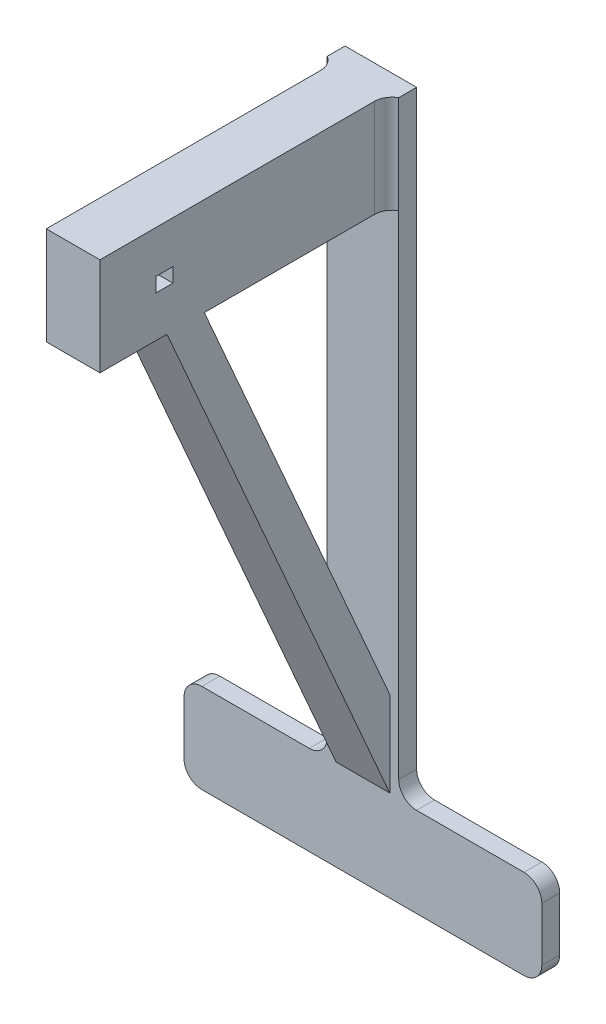
ISO-10303-21;
HEADER;
FILE_DESCRIPTION(('STEP AP214'),'2;1');
FILE_NAME('part.step','',(''),(''),'','','');
FILE_SCHEMA(('AUTOMOTIVE_DESIGN { 1 0 10303 214 1 1 1 1 }'));
ENDSEC;
DATA;
#1=APPLICATION_CONTEXT('core data for automotive mechanical design processes');
#2=APPLICATION_PROTOCOL_DEFINITION('international standard','automotive_design',2000,#1);
#3=PRODUCT_CONTEXT('',#1,'mechanical');
#4=PRODUCT('Part','Part','',(#3));
#5=PRODUCT_RELATED_PRODUCT_CATEGORY('part','',(#4));
#6=PRODUCT_DEFINITION_FORMATION('','',#4);
#7=PRODUCT_DEFINITION_CONTEXT('part definition',#1,'design');
#8=PRODUCT_DEFINITION('design','',#6,#7);
#9=PRODUCT_DEFINITION_SHAPE('','',#8);
#10=(LENGTH_UNIT() NAMED_UNIT(*) SI_UNIT(.MILLI.,.METRE.));
#11=(NAMED_UNIT(*) PLANE_ANGLE_UNIT() SI_UNIT($,.RADIAN.));
#12=(NAMED_UNIT(*) SI_UNIT($,.STERADIAN.) SOLID_ANGLE_UNIT());
#13=UNCERTAINTY_MEASURE_WITH_UNIT(LENGTH_MEASURE(1.E-05),#10,'distance_accuracy_value','');
#14=(GEOMETRIC_REPRESENTATION_CONTEXT(3) GLOBAL_UNCERTAINTY_ASSIGNED_CONTEXT((#13)) GLOBAL_UNIT_ASSIGNED_CONTEXT((#10,
#11,#12)) REPRESENTATION_CONTEXT('',''));
#15=CARTESIAN_POINT('',(0.,0.,0.));
#16=DIRECTION('',(0.,0.,1.));
#17=DIRECTION('',(1.,0.,0.));
#18=AXIS2_PLACEMENT_3D('',#15,#16,#17);
#19=CARTESIAN_POINT('',(7.50000000000001,155.127269073468,86.));
#20=DIRECTION('',(0.,1.,0.));
#21=DIRECTION('',(0.,0.,1.));
#22=AXIS2_PLACEMENT_3D('',#19,#20,#21);
#23=PLANE('',#22);
#24=DIRECTION('',(0.,0.,-1.));
#25=VECTOR('',#24,1.);
#26=CARTESIAN_POINT('',(-7.49999999999999,155.127269073468,86.));
#27=LINE('',#26,#25);
#28=CARTESIAN_POINT('',(-7.49999999999999,155.127269073468,86.));
#29=VERTEX_POINT('',#28);
#30=CARTESIAN_POINT('',(-7.49999999999999,155.127269073468,67.2752353118898));
#31=VERTEX_POINT('',#30);
#32=EDGE_CURVE('E298',#29,#31,#27,.T.);
#33=ORIENTED_EDGE('',*,*,#32,.T.);
#34=DIRECTION('',(1.,0.,0.));
#35=VECTOR('',#34,1.);
#36=CARTESIAN_POINT('',(7.50000000000001,155.127269073468,67.2752353118899));
#37=LINE('',#36,#35);
#38=CARTESIAN_POINT('',(7.49999999999999,155.127269073468,67.2752353118898));
#39=VERTEX_POINT('',#38);
#40=EDGE_CURVE('E273',#31,#39,#37,.T.);
#41=ORIENTED_EDGE('',*,*,#40,.T.);
#42=DIRECTION('',(0.,0.,-1.));
#43=VECTOR('',#42,1.);
#44=CARTESIAN_POINT('',(7.50000000000001,155.127269073468,86.));
#45=LINE('',#44,#43);
#46=CARTESIAN_POINT('',(7.50000000000001,155.127269073468,86.));
#47=VERTEX_POINT('',#46);
#48=EDGE_CURVE('E294',#47,#39,#45,.T.);
#49=ORIENTED_EDGE('',*,*,#48,.F.);
#50=DIRECTION('',(1.,0.,0.));
#51=VECTOR('',#50,1.);
#52=CARTESIAN_POINT('',(7.50000000000001,155.127269073468,86.));
#53=LINE('',#52,#51);
#54=EDGE_CURVE('E280',#29,#47,#53,.T.);
#55=ORIENTED_EDGE('',*,*,#54,.F.);
#56=EDGE_LOOP('',(#33,#41,#49,#55));
#57=FACE_BOUND('',#56,.T.);
#58=ADVANCED_FACE('F35',(#57),#23,.F.);
#59=CARTESIAN_POINT('',(0.,0.,5.));
#60=DIRECTION('',(0.,0.,-1.));
#61=DIRECTION('',(-1.,0.,0.));
#62=AXIS2_PLACEMENT_3D('',#59,#60,#61);
#63=PLANE('',#62);
#64=DIRECTION('',(1.,0.,0.));
#65=VECTOR('',#64,1.);
#66=CARTESIAN_POINT('',(-7.49999999999999,12.9494798792398,5.));
#67=LINE('',#66,#65);
#68=CARTESIAN_POINT('',(-7.49999999999999,12.9494798792398,5.));
#69=VERTEX_POINT('',#68);
#70=CARTESIAN_POINT('',(7.49999999999999,12.9494798792398,5.));
#71=VERTEX_POINT('',#70);
#72=EDGE_CURVE('E253',#69,#71,#67,.T.);
#73=ORIENTED_EDGE('',*,*,#72,.F.);
#74=DIRECTION('',(0.,-1.,0.));
#75=VECTOR('',#74,1.);
#76=CARTESIAN_POINT('',(-7.49999999999999,36.8009694669565,5.));
#77=LINE('',#76,#75);
#78=CARTESIAN_POINT('',(-7.49999999999999,36.8009694669565,5.));
#79=VERTEX_POINT('',#78);
#80=EDGE_CURVE('E251',#79,#69,#77,.T.);
#81=ORIENTED_EDGE('',*,*,#80,.F.);
#82=DIRECTION('',(-1.,0.,0.));
#83=VECTOR('',#82,1.);
#84=CARTESIAN_POINT('',(-7.49999999999999,36.8009694669565,5.));
#85=LINE('',#84,#83);
#86=CARTESIAN_POINT('',(7.49999999999999,36.8009694669565,5.));
#87=VERTEX_POINT('',#86);
#88=EDGE_CURVE('E260',#87,#79,#85,.T.);
#89=ORIENTED_EDGE('',*,*,#88,.F.);
#90=DIRECTION('',(0.,1.,0.));
#91=VECTOR('',#90,1.);
#92=CARTESIAN_POINT('',(7.49999999999999,36.8009694669565,5.));
#93=LINE('',#92,#91);
#94=EDGE_CURVE('E262',#71,#87,#93,.T.);
#95=ORIENTED_EDGE('',*,*,#94,.F.);
#96=EDGE_LOOP('',(#73,#81,#89,#95));
#97=FACE_BOUND('',#96,.T.);
#98=DIRECTION('',(0.,-1.,0.));
#99=VECTOR('',#98,1.);
#100=CARTESIAN_POINT('',(-50.,12.5,5.));
#101=LINE('',#100,#99);
#102=CARTESIAN_POINT('',(-50.,7.5,5.));
#103=VERTEX_POINT('',#102);
#104=CARTESIAN_POINT('',(-50.,-7.5,5.));
#105=VERTEX_POINT('',#104);
#106=EDGE_CURVE('E322',#103,#105,#101,.T.);
#107=ORIENTED_EDGE('',*,*,#106,.T.);
#108=CARTESIAN_POINT('',(-45.,-7.5,5.));
#109=DIRECTION('',(0.,0.,-1.));
#110=DIRECTION('',(-1.,0.,0.));
#111=AXIS2_PLACEMENT_3D('',#108,#109,#110);
#112=CIRCLE('',#111,5.);
#113=CARTESIAN_POINT('',(-45.,-12.5,5.));
#114=VERTEX_POINT('',#113);
#115=EDGE_CURVE('E405',#105,#114,#112,.F.);
#116=ORIENTED_EDGE('',*,*,#115,.T.);
#117=DIRECTION('',(1.,0.,0.));
#118=VECTOR('',#117,1.);
#119=CARTESIAN_POINT('',(50.,-12.5,5.));
#120=LINE('',#119,#118);
#121=CARTESIAN_POINT('',(45.,-12.5,5.));
#122=VERTEX_POINT('',#121);
#123=EDGE_CURVE('E325',#114,#122,#120,.T.);
#124=ORIENTED_EDGE('',*,*,#123,.T.);
#125=CARTESIAN_POINT('',(45.,-7.5,5.));
#126=DIRECTION('',(0.,0.,-1.));
#127=DIRECTION('',(-1.,0.,0.));
#128=AXIS2_PLACEMENT_3D('',#125,#126,#127);
#129=CIRCLE('',#128,5.);
#130=CARTESIAN_POINT('',(50.,-7.5,5.));
#131=VERTEX_POINT('',#130);
#132=EDGE_CURVE('E401',#122,#131,#129,.F.);
#133=ORIENTED_EDGE('',*,*,#132,.T.);
#134=DIRECTION('',(0.,1.,0.));
#135=VECTOR('',#134,1.);
#136=CARTESIAN_POINT('',(50.,12.5,5.));
#137=LINE('',#136,#135);
#138=CARTESIAN_POINT('',(50.,7.5,5.));
#139=VERTEX_POINT('',#138);
#140=EDGE_CURVE('E329',#131,#139,#137,.T.);
#141=ORIENTED_EDGE('',*,*,#140,.T.);
#142=CARTESIAN_POINT('',(45.,7.5,5.));
#143=DIRECTION('',(0.,0.,-1.));
#144=DIRECTION('',(-1.,0.,0.));
#145=AXIS2_PLACEMENT_3D('',#142,#143,#144);
#146=CIRCLE('',#145,5.);
#147=CARTESIAN_POINT('',(45.,12.5,5.));
#148=VERTEX_POINT('',#147);
#149=EDGE_CURVE('E399',#139,#148,#146,.F.);
#150=ORIENTED_EDGE('',*,*,#149,.T.);
#151=DIRECTION('',(-1.,0.,0.));
#152=VECTOR('',#151,1.);
#153=CARTESIAN_POINT('',(50.,12.5,5.));
#154=LINE('',#153,#152);
#155=CARTESIAN_POINT('',(15.,12.5,5.));
#156=VERTEX_POINT('',#155);
#157=EDGE_CURVE('E333',#148,#156,#154,.T.);
#158=ORIENTED_EDGE('',*,*,#157,.T.);
#159=CARTESIAN_POINT('',(15.,17.5,5.));
#160=DIRECTION('',(0.,0.,-1.));
#161=DIRECTION('',(-1.,0.,0.));
#162=AXIS2_PLACEMENT_3D('',#159,#160,#161);
#163=CIRCLE('',#162,5.);
#164=CARTESIAN_POINT('',(10.,17.5,5.));
#165=VERTEX_POINT('',#164);
#166=EDGE_CURVE('E379',#156,#165,#163,.T.);
#167=ORIENTED_EDGE('',*,*,#166,.T.);
#168=DIRECTION('',(0.,-1.,0.));
#169=VECTOR('',#168,1.);
#170=CARTESIAN_POINT('',(10.,182.5,5.));
#171=LINE('',#170,#169);
#172=CARTESIAN_POINT('',(10.,155.127269073468,5.));
#173=VERTEX_POINT('',#172);
#174=EDGE_CURVE('E313',#173,#165,#171,.T.);
#175=ORIENTED_EDGE('',*,*,#174,.F.);
#176=DIRECTION('',(1.,0.,0.));
#177=VECTOR('',#176,1.);
#178=CARTESIAN_POINT('',(7.50000000000001,155.127269073468,5.));
#179=LINE('',#178,#177);
#180=CARTESIAN_POINT('',(-10.,155.127269073468,5.));
#181=VERTEX_POINT('',#180);
#182=EDGE_CURVE('E276',#181,#173,#179,.T.);
#183=ORIENTED_EDGE('',*,*,#182,.F.);
#184=DIRECTION('',(0.,-1.,0.));
#185=VECTOR('',#184,1.);
#186=CARTESIAN_POINT('',(-10.,182.5,5.));
#187=LINE('',#186,#185);
#188=CARTESIAN_POINT('',(-10.,17.5,5.));
#189=VERTEX_POINT('',#188);
#190=EDGE_CURVE('E317',#181,#189,#187,.T.);
#191=ORIENTED_EDGE('',*,*,#190,.T.);
#192=CARTESIAN_POINT('',(-15.,17.5,5.));
#193=DIRECTION('',(0.,0.,-1.));
#194=DIRECTION('',(-1.,0.,0.));
#195=AXIS2_PLACEMENT_3D('',#192,#193,#194);
#196=CIRCLE('',#195,5.);
#197=CARTESIAN_POINT('',(-15.,12.5,5.));
#198=VERTEX_POINT('',#197);
#199=EDGE_CURVE('E372',#189,#198,#196,.T.);
#200=ORIENTED_EDGE('',*,*,#199,.T.);
#201=CARTESIAN_POINT('',(-45.,12.5,5.));
#202=VERTEX_POINT('',#201);
#203=EDGE_CURVE('E332',#198,#202,#154,.T.);
#204=ORIENTED_EDGE('',*,*,#203,.T.);
#205=CARTESIAN_POINT('',(-45.,7.5,5.));
#206=DIRECTION('',(0.,0.,-1.));
#207=DIRECTION('',(-1.,0.,0.));
#208=AXIS2_PLACEMENT_3D('',#205,#206,#207);
#209=CIRCLE('',#208,5.);
#210=EDGE_CURVE('E403',#202,#103,#209,.F.);
#211=ORIENTED_EDGE('',*,*,#210,.T.);
#212=EDGE_LOOP('',(#107,#116,#124,#133,#141,#150,#158,#167,#175,#183,#191,#200,#204,#211));
#213=FACE_BOUND('',#212,.T.);
#214=ADVANCED_FACE('F432',(#97,#213),#63,.F.);
#215=CARTESIAN_POINT('',(50.,12.5,5.));
#216=DIRECTION('',(0.,-1.,0.));
#217=DIRECTION('',(0.,0.,-1.));
#218=AXIS2_PLACEMENT_3D('',#215,#216,#217);
#219=PLANE('',#218);
#220=DIRECTION('',(-1.,0.,0.));
#221=VECTOR('',#220,1.);
#222=CARTESIAN_POINT('',(50.,12.5,0.));
#223=LINE('',#222,#221);
#224=CARTESIAN_POINT('',(-15.,12.5,0.));
#225=VERTEX_POINT('',#224);
#226=CARTESIAN_POINT('',(-45.,12.5,0.));
#227=VERTEX_POINT('',#226);
#228=EDGE_CURVE('E344',#225,#227,#223,.T.);
#229=ORIENTED_EDGE('',*,*,#228,.T.);
#230=DIRECTION('',(0.,0.,-1.));
#231=VECTOR('',#230,1.);
#232=CARTESIAN_POINT('',(-45.,12.5,5.));
#233=LINE('',#232,#231);
#234=EDGE_CURVE('E407',#227,#202,#233,.F.);
#235=ORIENTED_EDGE('',*,*,#234,.T.);
#236=ORIENTED_EDGE('',*,*,#203,.F.);
#237=DIRECTION('',(0.,0.,1.));
#238=VECTOR('',#237,1.);
#239=CARTESIAN_POINT('',(-15.,12.5,0.));
#240=LINE('',#239,#238);
#241=EDGE_CURVE('E364',#198,#225,#240,.F.);
#242=ORIENTED_EDGE('',*,*,#241,.T.);
#243=EDGE_LOOP('',(#229,#235,#236,#242));
#244=FACE_BOUND('',#243,.T.);
#245=ADVANCED_FACE('F459',(#244),#219,.F.);
#246=ORIENTED_EDGE('',*,*,#157,.F.);
#247=DIRECTION('',(0.,0.,-1.));
#248=VECTOR('',#247,1.);
#249=CARTESIAN_POINT('',(45.,12.5,5.));
#250=LINE('',#249,#248);
#251=CARTESIAN_POINT('',(45.,12.5,0.));
#252=VERTEX_POINT('',#251);
#253=EDGE_CURVE('E11',#148,#252,#250,.T.);
#254=ORIENTED_EDGE('',*,*,#253,.T.);
#255=CARTESIAN_POINT('',(15.,12.5,0.));
#256=VERTEX_POINT('',#255);
#257=EDGE_CURVE('E326',#252,#256,#223,.T.);
#258=ORIENTED_EDGE('',*,*,#257,.T.);
#259=DIRECTION('',(0.,0.,-1.));
#260=VECTOR('',#259,1.);
#261=CARTESIAN_POINT('',(15.,12.5,5.));
#262=LINE('',#261,#260);
#263=EDGE_CURVE('E369',#256,#156,#262,.F.);
#264=ORIENTED_EDGE('',*,*,#263,.T.);
#265=EDGE_LOOP('',(#246,#254,#258,#264));
#266=FACE_BOUND('',#265,.T.);
#267=ADVANCED_FACE('F428',(#266),#219,.F.);
#268=CARTESIAN_POINT('',(-50.,12.5,5.));
#269=DIRECTION('',(1.,0.,0.));
#270=DIRECTION('',(0.,0.,-1.));
#271=AXIS2_PLACEMENT_3D('',#268,#269,#270);
#272=PLANE('',#271);
#273=DIRECTION('',(0.,-1.,0.));
#274=VECTOR('',#273,1.);
#275=CARTESIAN_POINT('',(-50.,12.5,0.));
#276=LINE('',#275,#274);
#277=CARTESIAN_POINT('',(-50.,7.5,0.));
#278=VERTEX_POINT('',#277);
#279=CARTESIAN_POINT('',(-50.,-7.5,0.));
#280=VERTEX_POINT('',#279);
#281=EDGE_CURVE('E321',#278,#280,#276,.T.);
#282=ORIENTED_EDGE('',*,*,#281,.T.);
#283=DIRECTION('',(0.,0.,-1.));
#284=VECTOR('',#283,1.);
#285=CARTESIAN_POINT('',(-50.,-7.5,5.));
#286=LINE('',#285,#284);
#287=EDGE_CURVE('E397',#280,#105,#286,.F.);
#288=ORIENTED_EDGE('',*,*,#287,.T.);
#289=ORIENTED_EDGE('',*,*,#106,.F.);
#290=DIRECTION('',(0.,0.,-1.));
#291=VECTOR('',#290,1.);
#292=CARTESIAN_POINT('',(-50.,7.5,5.));
#293=LINE('',#292,#291);
#294=EDGE_CURVE('E394',#103,#278,#293,.T.);
#295=ORIENTED_EDGE('',*,*,#294,.T.);
#296=EDGE_LOOP('',(#282,#288,#289,#295));
#297=FACE_BOUND('',#296,.T.);
#298=ADVANCED_FACE('F445',(#297),#272,.F.);
#299=CARTESIAN_POINT('',(50.,-12.5,5.));
#300=DIRECTION('',(0.,1.,0.));
#301=DIRECTION('',(0.,0.,1.));
#302=AXIS2_PLACEMENT_3D('',#299,#300,#301);
#303=PLANE('',#302);
#304=ORIENTED_EDGE('',*,*,#123,.F.);
#305=DIRECTION('',(0.,0.,-1.));
#306=VECTOR('',#305,1.);
#307=CARTESIAN_POINT('',(-45.,-12.5,5.));
#308=LINE('',#307,#306);
#309=CARTESIAN_POINT('',(-45.,-12.5,0.));
#310=VERTEX_POINT('',#309);
#311=EDGE_CURVE('E383',#114,#310,#308,.T.);
#312=ORIENTED_EDGE('',*,*,#311,.T.);
#313=DIRECTION('',(1.,0.,0.));
#314=VECTOR('',#313,1.);
#315=CARTESIAN_POINT('',(50.,-12.5,0.));
#316=LINE('',#315,#314);
#317=CARTESIAN_POINT('',(45.,-12.5,0.));
#318=VERTEX_POINT('',#317);
#319=EDGE_CURVE('E338',#310,#318,#316,.T.);
#320=ORIENTED_EDGE('',*,*,#319,.T.);
#321=DIRECTION('',(0.,0.,-1.));
#322=VECTOR('',#321,1.);
#323=CARTESIAN_POINT('',(45.,-12.5,5.));
#324=LINE('',#323,#322);
#325=EDGE_CURVE('E381',#318,#122,#324,.F.);
#326=ORIENTED_EDGE('',*,*,#325,.T.);
#327=EDGE_LOOP('',(#304,#312,#320,#326));
#328=FACE_BOUND('',#327,.T.);
#329=ADVANCED_FACE('F439',(#328),#303,.F.);
#330=CARTESIAN_POINT('',(50.,12.5,5.));
#331=DIRECTION('',(-1.,0.,0.));
#332=DIRECTION('',(0.,0.,1.));
#333=AXIS2_PLACEMENT_3D('',#330,#331,#332);
#334=PLANE('',#333);
#335=ORIENTED_EDGE('',*,*,#140,.F.);
#336=DIRECTION('',(0.,0.,-1.));
#337=VECTOR('',#336,1.);
#338=CARTESIAN_POINT('',(50.,-7.5,5.));
#339=LINE('',#338,#337);
#340=CARTESIAN_POINT('',(50.,-7.5,0.));
#341=VERTEX_POINT('',#340);
#342=EDGE_CURVE('E43',#131,#341,#339,.T.);
#343=ORIENTED_EDGE('',*,*,#342,.T.);
#344=DIRECTION('',(0.,1.,0.));
#345=VECTOR('',#344,1.);
#346=CARTESIAN_POINT('',(50.,12.5,0.));
#347=LINE('',#346,#345);
#348=CARTESIAN_POINT('',(50.,7.5,0.));
#349=VERTEX_POINT('',#348);
#350=EDGE_CURVE('E341',#341,#349,#347,.T.);
#351=ORIENTED_EDGE('',*,*,#350,.T.);
#352=DIRECTION('',(0.,0.,-1.));
#353=VECTOR('',#352,1.);
#354=CARTESIAN_POINT('',(50.,7.5,5.));
#355=LINE('',#354,#353);
#356=EDGE_CURVE('E409',#349,#139,#355,.F.);
#357=ORIENTED_EDGE('',*,*,#356,.T.);
#358=EDGE_LOOP('',(#335,#343,#351,#357));
#359=FACE_BOUND('',#358,.T.);
#360=ADVANCED_FACE('F415',(#359),#334,.F.);
#361=CARTESIAN_POINT('',(0.,0.,0.));
#362=DIRECTION('',(0.,0.,-1.));
#363=DIRECTION('',(-1.,0.,0.));
#364=AXIS2_PLACEMENT_3D('',#361,#362,#363);
#365=PLANE('',#364);
#366=ORIENTED_EDGE('',*,*,#319,.F.);
#367=CARTESIAN_POINT('',(-45.,-7.5,0.));
#368=DIRECTION('',(0.,0.,-1.));
#369=DIRECTION('',(-1.,0.,0.));
#370=AXIS2_PLACEMENT_3D('',#367,#368,#369);
#371=CIRCLE('',#370,5.);
#372=EDGE_CURVE('E392',#310,#280,#371,.T.);
#373=ORIENTED_EDGE('',*,*,#372,.T.);
#374=ORIENTED_EDGE('',*,*,#281,.F.);
#375=CARTESIAN_POINT('',(-45.,7.5,0.));
#376=DIRECTION('',(0.,0.,-1.));
#377=DIRECTION('',(-1.,0.,0.));
#378=AXIS2_PLACEMENT_3D('',#375,#376,#377);
#379=CIRCLE('',#378,5.);
#380=EDGE_CURVE('E390',#278,#227,#379,.T.);
#381=ORIENTED_EDGE('',*,*,#380,.T.);
#382=ORIENTED_EDGE('',*,*,#228,.F.);
#383=CARTESIAN_POINT('',(-15.,17.5,0.));
#384=DIRECTION('',(0.,0.,-1.));
#385=DIRECTION('',(-1.,0.,0.));
#386=AXIS2_PLACEMENT_3D('',#383,#384,#385);
#387=CIRCLE('',#386,5.);
#388=CARTESIAN_POINT('',(-10.,17.5,0.));
#389=VERTEX_POINT('',#388);
#390=EDGE_CURVE('E374',#225,#389,#387,.F.);
#391=ORIENTED_EDGE('',*,*,#390,.T.);
#392=DIRECTION('',(0.,-1.,0.));
#393=VECTOR('',#392,1.);
#394=CARTESIAN_POINT('',(-10.,182.5,0.));
#395=LINE('',#394,#393);
#396=CARTESIAN_POINT('',(-10.,182.5,0.));
#397=VERTEX_POINT('',#396);
#398=EDGE_CURVE('E307',#397,#389,#395,.T.);
#399=ORIENTED_EDGE('',*,*,#398,.F.);
#400=DIRECTION('',(-1.,0.,0.));
#401=VECTOR('',#400,1.);
#402=CARTESIAN_POINT('',(10.,182.5,0.));
#403=LINE('',#402,#401);
#404=CARTESIAN_POINT('',(10.,182.5,0.));
#405=VERTEX_POINT('',#404);
#406=EDGE_CURVE('E305',#405,#397,#403,.T.);
#407=ORIENTED_EDGE('',*,*,#406,.F.);
#408=DIRECTION('',(0.,-1.,0.));
#409=VECTOR('',#408,1.);
#410=CARTESIAN_POINT('',(10.,182.5,0.));
#411=LINE('',#410,#409);
#412=CARTESIAN_POINT('',(10.,17.5,0.));
#413=VERTEX_POINT('',#412);
#414=EDGE_CURVE('E310',#405,#413,#411,.T.);
#415=ORIENTED_EDGE('',*,*,#414,.T.);
#416=CARTESIAN_POINT('',(15.,17.5,0.));
#417=DIRECTION('',(0.,0.,-1.));
#418=DIRECTION('',(-1.,0.,0.));
#419=AXIS2_PLACEMENT_3D('',#416,#417,#418);
#420=CIRCLE('',#419,5.);
#421=EDGE_CURVE('E376',#413,#256,#420,.F.);
#422=ORIENTED_EDGE('',*,*,#421,.T.);
#423=ORIENTED_EDGE('',*,*,#257,.F.);
#424=CARTESIAN_POINT('',(45.,7.5,0.));
#425=DIRECTION('',(0.,0.,-1.));
#426=DIRECTION('',(-1.,0.,0.));
#427=AXIS2_PLACEMENT_3D('',#424,#425,#426);
#428=CIRCLE('',#427,5.);
#429=EDGE_CURVE('E386',#252,#349,#428,.T.);
#430=ORIENTED_EDGE('',*,*,#429,.T.);
#431=ORIENTED_EDGE('',*,*,#350,.F.);
#432=CARTESIAN_POINT('',(45.,-7.5,0.));
#433=DIRECTION('',(0.,0.,-1.));
#434=DIRECTION('',(-1.,0.,0.));
#435=AXIS2_PLACEMENT_3D('',#432,#433,#434);
#436=CIRCLE('',#435,5.);
#437=EDGE_CURVE('E388',#341,#318,#436,.T.);
#438=ORIENTED_EDGE('',*,*,#437,.T.);
#439=EDGE_LOOP('',(#366,#373,#374,#381,#382,#391,#399,#407,#415,#422,#423,#430,#431,#438));
#440=FACE_BOUND('',#439,.T.);
#441=ADVANCED_FACE('F421',(#440),#365,.T.);
#442=CARTESIAN_POINT('',(-10.,182.5,5.));
#443=DIRECTION('',(1.,0.,0.));
#444=DIRECTION('',(0.,0.,-1.));
#445=AXIS2_PLACEMENT_3D('',#442,#443,#444);
#446=PLANE('',#445);
#447=ORIENTED_EDGE('',*,*,#398,.T.);
#448=DIRECTION('',(0.,0.,1.));
#449=VECTOR('',#448,1.);
#450=CARTESIAN_POINT('',(-10.,17.5,5.));
#451=LINE('',#450,#449);
#452=EDGE_CURVE('E361',#389,#189,#451,.T.);
#453=ORIENTED_EDGE('',*,*,#452,.T.);
#454=ORIENTED_EDGE('',*,*,#190,.F.);
#455=CARTESIAN_POINT('',(-10.,182.5,5.));
#456=VERTEX_POINT('',#455);
#457=EDGE_CURVE('E318',#456,#181,#187,.T.);
#458=ORIENTED_EDGE('',*,*,#457,.F.);
#459=DIRECTION('',(0.,0.,1.));
#460=VECTOR('',#459,1.);
#461=CARTESIAN_POINT('',(-10.,182.5,5.));
#462=LINE('',#461,#460);
#463=EDGE_CURVE('E301',#397,#456,#462,.T.);
#464=ORIENTED_EDGE('',*,*,#463,.F.);
#465=EDGE_LOOP('',(#447,#453,#454,#458,#464));
#466=FACE_BOUND('',#465,.T.);
#467=ADVANCED_FACE('F469',(#466),#446,.F.);
#468=CARTESIAN_POINT('',(10.,182.5,5.));
#469=DIRECTION('',(-1.,0.,0.));
#470=DIRECTION('',(0.,0.,1.));
#471=AXIS2_PLACEMENT_3D('',#468,#469,#470);
#472=PLANE('',#471);
#473=ORIENTED_EDGE('',*,*,#174,.T.);
#474=DIRECTION('',(0.,0.,-1.));
#475=VECTOR('',#474,1.);
#476=CARTESIAN_POINT('',(10.,17.5,0.));
#477=LINE('',#476,#475);
#478=EDGE_CURVE('E366',#165,#413,#477,.T.);
#479=ORIENTED_EDGE('',*,*,#478,.T.);
#480=ORIENTED_EDGE('',*,*,#414,.F.);
#481=DIRECTION('',(0.,0.,-1.));
#482=VECTOR('',#481,1.);
#483=CARTESIAN_POINT('',(10.,182.5,5.));
#484=LINE('',#483,#482);
#485=CARTESIAN_POINT('',(10.,182.5,5.));
#486=VERTEX_POINT('',#485);
#487=EDGE_CURVE('E303',#486,#405,#484,.T.);
#488=ORIENTED_EDGE('',*,*,#487,.F.);
#489=EDGE_CURVE('E314',#486,#173,#171,.T.);
#490=ORIENTED_EDGE('',*,*,#489,.T.);
#491=EDGE_LOOP('',(#473,#479,#480,#488,#490));
#492=FACE_BOUND('',#491,.T.);
#493=ADVANCED_FACE('F480',(#492),#472,.F.);
#494=CARTESIAN_POINT('',(0.,182.5,0.));
#495=DIRECTION('',(0.,1.,0.));
#496=DIRECTION('',(0.,0.,1.));
#497=AXIS2_PLACEMENT_3D('',#494,#495,#496);
#498=PLANE('',#497);
#499=ORIENTED_EDGE('',*,*,#463,.T.);
#500=CARTESIAN_POINT('',(-12.5,182.5,9.33012701892221));
#501=DIRECTION('',(0.,1.,0.));
#502=DIRECTION('',(0.,0.,1.));
#503=AXIS2_PLACEMENT_3D('',#500,#501,#502);
#504=CIRCLE('',#503,5.);
#505=CARTESIAN_POINT('',(-7.49999999999999,182.5,9.33012701892222));
#506=VERTEX_POINT('',#505);
#507=EDGE_CURVE('E354',#456,#506,#504,.F.);
#508=ORIENTED_EDGE('',*,*,#507,.T.);
#509=DIRECTION('',(0.,0.,-1.));
#510=VECTOR('',#509,1.);
#511=CARTESIAN_POINT('',(-7.49999999999999,182.5,86.));
#512=LINE('',#511,#510);
#513=CARTESIAN_POINT('',(-7.49999999999999,182.5,86.));
#514=VERTEX_POINT('',#513);
#515=EDGE_CURVE('E286',#514,#506,#512,.T.);
#516=ORIENTED_EDGE('',*,*,#515,.F.);
#517=DIRECTION('',(-1.,0.,0.));
#518=VECTOR('',#517,1.);
#519=CARTESIAN_POINT('',(7.5,182.5,86.));
#520=LINE('',#519,#518);
#521=CARTESIAN_POINT('',(7.5,182.5,86.));
#522=VERTEX_POINT('',#521);
#523=EDGE_CURVE('E284',#522,#514,#520,.T.);
#524=ORIENTED_EDGE('',*,*,#523,.F.);
#525=DIRECTION('',(0.,0.,-1.));
#526=VECTOR('',#525,1.);
#527=CARTESIAN_POINT('',(7.5,182.5,86.));
#528=LINE('',#527,#526);
#529=CARTESIAN_POINT('',(7.5,182.5,9.33012701892218));
#530=VERTEX_POINT('',#529);
#531=EDGE_CURVE('E290',#522,#530,#528,.T.);
#532=ORIENTED_EDGE('',*,*,#531,.T.);
#533=CARTESIAN_POINT('',(12.5,182.5,9.33012701892218));
#534=DIRECTION('',(0.,1.,0.));
#535=DIRECTION('',(0.,0.,1.));
#536=AXIS2_PLACEMENT_3D('',#533,#534,#535);
#537=CIRCLE('',#536,5.);
#538=EDGE_CURVE('E356',#530,#486,#537,.F.);
#539=ORIENTED_EDGE('',*,*,#538,.T.);
#540=ORIENTED_EDGE('',*,*,#487,.T.);
#541=ORIENTED_EDGE('',*,*,#406,.T.);
#542=EDGE_LOOP('',(#499,#508,#516,#524,#532,#539,#540,#541));
#543=FACE_BOUND('',#542,.T.);
#544=ADVANCED_FACE('F475',(#543),#498,.T.);
#545=CARTESIAN_POINT('',(-7.49999999999999,155.127269073468,86.));
#546=DIRECTION('',(1.,0.,0.));
#547=DIRECTION('',(0.,1.,0.));
#548=AXIS2_PLACEMENT_3D('',#545,#546,#547);
#549=PLANE('',#548);
#550=DIRECTION('',(0.,0.,-1.));
#551=VECTOR('',#550,1.);
#552=CARTESIAN_POINT('',(-7.49999999999999,166.654354293278,86.));
#553=LINE('',#552,#551);
#554=CARTESIAN_POINT('',(-7.50000000000002,166.654354293278,70.3402741407475));
#555=VERTEX_POINT('',#554);
#556=CARTESIAN_POINT('',(-7.50000000000002,166.654354293278,65.6130014134747));
#557=VERTEX_POINT('',#556);
#558=EDGE_CURVE('E245',#555,#557,#553,.T.);
#559=ORIENTED_EDGE('',*,*,#558,.T.);
#560=DIRECTION('',(0.,1.,0.));
#561=VECTOR('',#560,1.);
#562=CARTESIAN_POINT('',(-7.49999999999999,155.127269073468,65.6130014134747));
#563=LINE('',#562,#561);
#564=CARTESIAN_POINT('',(-7.50000000000002,170.654354293278,65.6130014134747));
#565=VERTEX_POINT('',#564);
#566=EDGE_CURVE('E248',#557,#565,#563,.T.);
#567=ORIENTED_EDGE('',*,*,#566,.T.);
#568=DIRECTION('',(0.,0.,1.));
#569=VECTOR('',#568,1.);
#570=CARTESIAN_POINT('',(-7.49999999999999,170.654354293278,86.));
#571=LINE('',#570,#569);
#572=CARTESIAN_POINT('',(-7.49999999999999,170.654354293278,70.3402741407475));
#573=VERTEX_POINT('',#572);
#574=EDGE_CURVE('E240',#565,#573,#571,.T.);
#575=ORIENTED_EDGE('',*,*,#574,.T.);
#576=DIRECTION('',(0.,-1.,0.));
#577=VECTOR('',#576,1.);
#578=CARTESIAN_POINT('',(-7.49999999999999,155.127269073468,70.3402741407475));
#579=LINE('',#578,#577);
#580=EDGE_CURVE('E220',#573,#555,#579,.T.);
#581=ORIENTED_EDGE('',*,*,#580,.T.);
#582=EDGE_LOOP('',(#559,#567,#575,#581));
#583=FACE_BOUND('',#582,.T.);
#584=DIRECTION('',(0.,0.915985844032445,0.401210585020098));
#585=VECTOR('',#584,1.);
#586=CARTESIAN_POINT('',(-7.49999999999999,12.9494798792398,5.));
#587=LINE('',#586,#585);
#588=EDGE_CURVE('E254',#69,#31,#587,.T.);
#589=ORIENTED_EDGE('',*,*,#588,.T.);
#590=ORIENTED_EDGE('',*,*,#32,.F.);
#591=DIRECTION('',(0.,-1.,0.));
#592=VECTOR('',#591,1.);
#593=CARTESIAN_POINT('',(-7.49999999999999,155.127269073468,86.));
#594=LINE('',#593,#592);
#595=EDGE_CURVE('E277',#514,#29,#594,.T.);
#596=ORIENTED_EDGE('',*,*,#595,.F.);
#597=ORIENTED_EDGE('',*,*,#515,.T.);
#598=DIRECTION('',(0.,-1.,0.));
#599=VECTOR('',#598,1.);
#600=CARTESIAN_POINT('',(-7.49999999999999,155.127269073468,9.33012701892222));
#601=LINE('',#600,#599);
#602=CARTESIAN_POINT('',(-7.49999999999999,155.127269073468,9.33012701892222));
#603=VERTEX_POINT('',#602);
#604=EDGE_CURVE('E335',#506,#603,#601,.T.);
#605=ORIENTED_EDGE('',*,*,#604,.T.);
#606=CARTESIAN_POINT('',(-7.49999999999999,155.127269073468,56.8280541098738));
#607=VERTEX_POINT('',#606);
#608=EDGE_CURVE('E297',#607,#603,#27,.T.);
#609=ORIENTED_EDGE('',*,*,#608,.F.);
#610=DIRECTION('',(0.,0.915985844032445,0.401210585020098));
#611=VECTOR('',#610,1.);
#612=CARTESIAN_POINT('',(-7.49999999999999,36.8009694669565,5.));
#613=LINE('',#612,#611);
#614=EDGE_CURVE('E258',#79,#607,#613,.T.);
#615=ORIENTED_EDGE('',*,*,#614,.F.);
#616=ORIENTED_EDGE('',*,*,#80,.T.);
#617=EDGE_LOOP('',(#589,#590,#596,#597,#605,#609,#615,#616));
#618=FACE_BOUND('',#617,.T.);
#619=ADVANCED_FACE('F506',(#583,#618),#549,.F.);
#620=CARTESIAN_POINT('',(7.49999999999999,155.127269073468,56.8280541098738));
#621=VERTEX_POINT('',#620);
#622=CARTESIAN_POINT('',(7.50000000000001,155.127269073468,9.33012701892218));
#623=VERTEX_POINT('',#622);
#624=EDGE_CURVE('E293',#621,#623,#45,.T.);
#625=ORIENTED_EDGE('',*,*,#624,.F.);
#626=DIRECTION('',(-1.,0.,0.));
#627=VECTOR('',#626,1.);
#628=CARTESIAN_POINT('',(7.5,155.127269073468,56.8280541098738));
#629=LINE('',#628,#627);
#630=EDGE_CURVE('E269',#621,#607,#629,.T.);
#631=ORIENTED_EDGE('',*,*,#630,.T.);
#632=ORIENTED_EDGE('',*,*,#608,.T.);
#633=CARTESIAN_POINT('',(-12.5,155.127269073468,9.33012701892221));
#634=DIRECTION('',(0.,1.,0.));
#635=DIRECTION('',(0.,0.,1.));
#636=AXIS2_PLACEMENT_3D('',#633,#634,#635);
#637=CIRCLE('',#636,5.);
#638=EDGE_CURVE('E351',#603,#181,#637,.T.);
#639=ORIENTED_EDGE('',*,*,#638,.T.);
#640=ORIENTED_EDGE('',*,*,#182,.T.);
#641=CARTESIAN_POINT('',(12.5,155.127269073468,9.33012701892218));
#642=DIRECTION('',(0.,1.,0.));
#643=DIRECTION('',(0.,0.,1.));
#644=AXIS2_PLACEMENT_3D('',#641,#642,#643);
#645=CIRCLE('',#644,5.);
#646=EDGE_CURVE('E358',#173,#623,#645,.T.);
#647=ORIENTED_EDGE('',*,*,#646,.T.);
#648=EDGE_LOOP('',(#625,#631,#632,#639,#640,#647));
#649=FACE_BOUND('',#648,.T.);
#650=ADVANCED_FACE('F497',(#649),#23,.F.);
#651=CARTESIAN_POINT('',(7.50000000000001,155.127269073468,86.));
#652=DIRECTION('',(-1.,0.,0.));
#653=DIRECTION('',(0.,-1.,0.));
#654=AXIS2_PLACEMENT_3D('',#651,#652,#653);
#655=PLANE('',#654);
#656=DIRECTION('',(0.,0.,1.));
#657=VECTOR('',#656,1.);
#658=CARTESIAN_POINT('',(7.50000000000001,170.654354293278,70.3402741407475));
#659=LINE('',#658,#657);
#660=CARTESIAN_POINT('',(7.50000000000001,170.654354293278,65.6130014134747));
#661=VERTEX_POINT('',#660);
#662=CARTESIAN_POINT('',(7.50000000000001,170.654354293278,70.3402741407475));
#663=VERTEX_POINT('',#662);
#664=EDGE_CURVE('E226',#661,#663,#659,.T.);
#665=ORIENTED_EDGE('',*,*,#664,.F.);
#666=DIRECTION('',(0.,1.,0.));
#667=VECTOR('',#666,1.);
#668=CARTESIAN_POINT('',(7.50000000000001,170.654354293278,65.6130014134747));
#669=LINE('',#668,#667);
#670=CARTESIAN_POINT('',(7.50000000000001,166.654354293278,65.6130014134747));
#671=VERTEX_POINT('',#670);
#672=EDGE_CURVE('E58',#671,#661,#669,.T.);
#673=ORIENTED_EDGE('',*,*,#672,.F.);
#674=DIRECTION('',(0.,0.,-1.));
#675=VECTOR('',#674,1.);
#676=CARTESIAN_POINT('',(7.50000000000001,166.654354293278,70.3402741407475));
#677=LINE('',#676,#675);
#678=CARTESIAN_POINT('',(7.50000000000001,166.654354293278,70.3402741407475));
#679=VERTEX_POINT('',#678);
#680=EDGE_CURVE('E233',#679,#671,#677,.T.);
#681=ORIENTED_EDGE('',*,*,#680,.F.);
#682=DIRECTION('',(0.,-1.,0.));
#683=VECTOR('',#682,1.);
#684=CARTESIAN_POINT('',(7.50000000000001,170.654354293278,70.3402741407475));
#685=LINE('',#684,#683);
#686=EDGE_CURVE('E217',#663,#679,#685,.T.);
#687=ORIENTED_EDGE('',*,*,#686,.F.);
#688=EDGE_LOOP('',(#665,#673,#681,#687));
#689=FACE_BOUND('',#688,.T.);
#690=ORIENTED_EDGE('',*,*,#48,.T.);
#691=DIRECTION('',(0.,0.915985844032445,0.401210585020098));
#692=VECTOR('',#691,1.);
#693=CARTESIAN_POINT('',(7.49999999999999,12.9494798792398,5.));
#694=LINE('',#693,#692);
#695=EDGE_CURVE('E257',#71,#39,#694,.T.);
#696=ORIENTED_EDGE('',*,*,#695,.F.);
#697=ORIENTED_EDGE('',*,*,#94,.T.);
#698=DIRECTION('',(0.,0.915985844032445,0.401210585020098));
#699=VECTOR('',#698,1.);
#700=CARTESIAN_POINT('',(7.49999999999999,36.8009694669565,5.));
#701=LINE('',#700,#699);
#702=EDGE_CURVE('E264',#87,#621,#701,.T.);
#703=ORIENTED_EDGE('',*,*,#702,.T.);
#704=ORIENTED_EDGE('',*,*,#624,.T.);
#705=DIRECTION('',(0.,1.,0.));
#706=VECTOR('',#705,1.);
#707=CARTESIAN_POINT('',(7.50000000000001,155.127269073468,9.33012701892218));
#708=LINE('',#707,#706);
#709=EDGE_CURVE('E348',#623,#530,#708,.T.);
#710=ORIENTED_EDGE('',*,*,#709,.T.);
#711=ORIENTED_EDGE('',*,*,#531,.F.);
#712=DIRECTION('',(0.,1.,0.));
#713=VECTOR('',#712,1.);
#714=CARTESIAN_POINT('',(7.50000000000001,155.127269073468,86.));
#715=LINE('',#714,#713);
#716=EDGE_CURVE('E282',#47,#522,#715,.T.);
#717=ORIENTED_EDGE('',*,*,#716,.F.);
#718=EDGE_LOOP('',(#690,#696,#697,#703,#704,#710,#711,#717));
#719=FACE_BOUND('',#718,.T.);
#720=ADVANCED_FACE('F230',(#689,#719),#655,.F.);
#721=CARTESIAN_POINT('',(0.,0.,86.));
#722=DIRECTION('',(0.,0.,1.));
#723=DIRECTION('',(1.,0.,0.));
#724=AXIS2_PLACEMENT_3D('',#721,#722,#723);
#725=PLANE('',#724);
#726=ORIENTED_EDGE('',*,*,#595,.T.);
#727=ORIENTED_EDGE('',*,*,#54,.T.);
#728=ORIENTED_EDGE('',*,*,#716,.T.);
#729=ORIENTED_EDGE('',*,*,#523,.T.);
#730=EDGE_LOOP('',(#726,#727,#728,#729));
#731=FACE_BOUND('',#730,.T.);
#732=ADVANCED_FACE('F512',(#731),#725,.T.);
#733=CARTESIAN_POINT('',(-12.5,0.,9.33012701892221));
#734=DIRECTION('',(0.,-1.,0.));
#735=DIRECTION('',(0.,0.,-1.));
#736=AXIS2_PLACEMENT_3D('',#733,#734,#735);
#737=CYLINDRICAL_SURFACE('',#736,5.);
#738=ORIENTED_EDGE('',*,*,#507,.F.);
#739=ORIENTED_EDGE('',*,*,#457,.T.);
#740=ORIENTED_EDGE('',*,*,#638,.F.);
#741=ORIENTED_EDGE('',*,*,#604,.F.);
#742=EDGE_LOOP('',(#738,#739,#740,#741));
#743=FACE_BOUND('',#742,.T.);
#744=ADVANCED_FACE('F540',(#743),#737,.F.);
#745=CARTESIAN_POINT('',(12.5,0.,9.33012701892218));
#746=DIRECTION('',(0.,1.,0.));
#747=DIRECTION('',(0.,0.,1.));
#748=AXIS2_PLACEMENT_3D('',#745,#746,#747);
#749=CYLINDRICAL_SURFACE('',#748,5.);
#750=ORIENTED_EDGE('',*,*,#646,.F.);
#751=ORIENTED_EDGE('',*,*,#489,.F.);
#752=ORIENTED_EDGE('',*,*,#538,.F.);
#753=ORIENTED_EDGE('',*,*,#709,.F.);
#754=EDGE_LOOP('',(#750,#751,#752,#753));
#755=FACE_BOUND('',#754,.T.);
#756=ADVANCED_FACE('F538',(#755),#749,.F.);
#757=CARTESIAN_POINT('',(-7.49999999999999,12.9494798792398,5.));
#758=DIRECTION('',(0.,-0.401210585020098,0.915985844032445));
#759=DIRECTION('',(0.,-0.915985844032445,-0.401210585020098));
#760=AXIS2_PLACEMENT_3D('',#757,#758,#759);
#761=PLANE('',#760);
#762=ORIENTED_EDGE('',*,*,#40,.F.);
#763=ORIENTED_EDGE('',*,*,#588,.F.);
#764=ORIENTED_EDGE('',*,*,#72,.T.);
#765=ORIENTED_EDGE('',*,*,#695,.T.);
#766=EDGE_LOOP('',(#762,#763,#764,#765));
#767=FACE_BOUND('',#766,.T.);
#768=ADVANCED_FACE('F529',(#767),#761,.T.);
#769=CARTESIAN_POINT('',(-7.49999999999999,36.8009694669565,5.));
#770=DIRECTION('',(0.,0.401210585020098,-0.915985844032445));
#771=DIRECTION('',(0.,0.915985844032445,0.401210585020098));
#772=AXIS2_PLACEMENT_3D('',#769,#770,#771);
#773=PLANE('',#772);
#774=ORIENTED_EDGE('',*,*,#630,.F.);
#775=ORIENTED_EDGE('',*,*,#702,.F.);
#776=ORIENTED_EDGE('',*,*,#88,.T.);
#777=ORIENTED_EDGE('',*,*,#614,.T.);
#778=EDGE_LOOP('',(#774,#775,#776,#777));
#779=FACE_BOUND('',#778,.T.);
#780=ADVANCED_FACE('F492',(#779),#773,.T.);
#781=CARTESIAN_POINT('',(-15.,17.5,5.));
#782=DIRECTION('',(0.,0.,-1.));
#783=DIRECTION('',(-1.,0.,0.));
#784=AXIS2_PLACEMENT_3D('',#781,#782,#783);
#785=CYLINDRICAL_SURFACE('',#784,5.);
#786=ORIENTED_EDGE('',*,*,#390,.F.);
#787=ORIENTED_EDGE('',*,*,#241,.F.);
#788=ORIENTED_EDGE('',*,*,#199,.F.);
#789=ORIENTED_EDGE('',*,*,#452,.F.);
#790=EDGE_LOOP('',(#786,#787,#788,#789));
#791=FACE_BOUND('',#790,.T.);
#792=ADVANCED_FACE('F463',(#791),#785,.F.);
#793=CARTESIAN_POINT('',(15.,17.5,5.));
#794=DIRECTION('',(0.,0.,1.));
#795=DIRECTION('',(1.,0.,0.));
#796=AXIS2_PLACEMENT_3D('',#793,#794,#795);
#797=CYLINDRICAL_SURFACE('',#796,5.);
#798=ORIENTED_EDGE('',*,*,#166,.F.);
#799=ORIENTED_EDGE('',*,*,#263,.F.);
#800=ORIENTED_EDGE('',*,*,#421,.F.);
#801=ORIENTED_EDGE('',*,*,#478,.F.);
#802=EDGE_LOOP('',(#798,#799,#800,#801));
#803=FACE_BOUND('',#802,.T.);
#804=ADVANCED_FACE('F484',(#803),#797,.F.);
#805=CARTESIAN_POINT('',(-45.,-7.5,5.));
#806=DIRECTION('',(0.,0.,-1.));
#807=DIRECTION('',(-1.,0.,0.));
#808=AXIS2_PLACEMENT_3D('',#805,#806,#807);
#809=CYLINDRICAL_SURFACE('',#808,5.);
#810=ORIENTED_EDGE('',*,*,#115,.F.);
#811=ORIENTED_EDGE('',*,*,#287,.F.);
#812=ORIENTED_EDGE('',*,*,#372,.F.);
#813=ORIENTED_EDGE('',*,*,#311,.F.);
#814=EDGE_LOOP('',(#810,#811,#812,#813));
#815=FACE_BOUND('',#814,.T.);
#816=ADVANCED_FACE('F449',(#815),#809,.T.);
#817=CARTESIAN_POINT('',(-45.,7.5,5.));
#818=DIRECTION('',(0.,0.,-1.));
#819=DIRECTION('',(-1.,0.,0.));
#820=AXIS2_PLACEMENT_3D('',#817,#818,#819);
#821=CYLINDRICAL_SURFACE('',#820,5.);
#822=ORIENTED_EDGE('',*,*,#210,.F.);
#823=ORIENTED_EDGE('',*,*,#234,.F.);
#824=ORIENTED_EDGE('',*,*,#380,.F.);
#825=ORIENTED_EDGE('',*,*,#294,.F.);
#826=EDGE_LOOP('',(#822,#823,#824,#825));
#827=FACE_BOUND('',#826,.T.);
#828=ADVANCED_FACE('F453',(#827),#821,.T.);
#829=CARTESIAN_POINT('',(45.,-7.5,5.));
#830=DIRECTION('',(0.,0.,-1.));
#831=DIRECTION('',(-1.,0.,0.));
#832=AXIS2_PLACEMENT_3D('',#829,#830,#831);
#833=CYLINDRICAL_SURFACE('',#832,5.);
#834=ORIENTED_EDGE('',*,*,#132,.F.);
#835=ORIENTED_EDGE('',*,*,#325,.F.);
#836=ORIENTED_EDGE('',*,*,#437,.F.);
#837=ORIENTED_EDGE('',*,*,#342,.F.);
#838=EDGE_LOOP('',(#834,#835,#836,#837));
#839=FACE_BOUND('',#838,.T.);
#840=ADVANCED_FACE('F437',(#839),#833,.T.);
#841=CARTESIAN_POINT('',(45.,7.5,5.));
#842=DIRECTION('',(0.,0.,-1.));
#843=DIRECTION('',(-1.,0.,0.));
#844=AXIS2_PLACEMENT_3D('',#841,#842,#843);
#845=CYLINDRICAL_SURFACE('',#844,5.);
#846=ORIENTED_EDGE('',*,*,#149,.F.);
#847=ORIENTED_EDGE('',*,*,#356,.F.);
#848=ORIENTED_EDGE('',*,*,#429,.F.);
#849=ORIENTED_EDGE('',*,*,#253,.F.);
#850=EDGE_LOOP('',(#846,#847,#848,#849));
#851=FACE_BOUND('',#850,.T.);
#852=ADVANCED_FACE('F37',(#851),#845,.T.);
#853=CARTESIAN_POINT('',(-92.5,170.654354293278,65.6130014134747));
#854=DIRECTION('',(0.,0.,-1.));
#855=DIRECTION('',(-1.,0.,0.));
#856=AXIS2_PLACEMENT_3D('',#853,#854,#855);
#857=PLANE('',#856);
#858=DIRECTION('',(1.,0.,0.));
#859=VECTOR('',#858,1.);
#860=CARTESIAN_POINT('',(-92.5,166.654354293278,65.6130014134747));
#861=LINE('',#860,#859);
#862=EDGE_CURVE('E238',#557,#671,#861,.T.);
#863=ORIENTED_EDGE('',*,*,#862,.T.);
#864=ORIENTED_EDGE('',*,*,#672,.T.);
#865=DIRECTION('',(1.,0.,0.));
#866=VECTOR('',#865,1.);
#867=CARTESIAN_POINT('',(-92.5,170.654354293278,65.6130014134747));
#868=LINE('',#867,#866);
#869=EDGE_CURVE('E223',#565,#661,#868,.T.);
#870=ORIENTED_EDGE('',*,*,#869,.F.);
#871=ORIENTED_EDGE('',*,*,#566,.F.);
#872=EDGE_LOOP('',(#863,#864,#870,#871));
#873=FACE_BOUND('',#872,.T.);
#874=ADVANCED_FACE('F596',(#873),#857,.F.);
#875=CARTESIAN_POINT('',(-92.5,166.654354293278,70.3402741407475));
#876=DIRECTION('',(0.,-1.,0.));
#877=DIRECTION('',(1.,0.,0.));
#878=AXIS2_PLACEMENT_3D('',#875,#876,#877);
#879=PLANE('',#878);
#880=DIRECTION('',(1.,0.,0.));
#881=VECTOR('',#880,1.);
#882=CARTESIAN_POINT('',(-92.5,166.654354293278,70.3402741407475));
#883=LINE('',#882,#881);
#884=EDGE_CURVE('E222',#555,#679,#883,.T.);
#885=ORIENTED_EDGE('',*,*,#884,.T.);
#886=ORIENTED_EDGE('',*,*,#680,.T.);
#887=ORIENTED_EDGE('',*,*,#862,.F.);
#888=ORIENTED_EDGE('',*,*,#558,.F.);
#889=EDGE_LOOP('',(#885,#886,#887,#888));
#890=FACE_BOUND('',#889,.T.);
#891=ADVANCED_FACE('F601',(#890),#879,.F.);
#892=CARTESIAN_POINT('',(-92.5,170.654354293278,70.3402741407475));
#893=DIRECTION('',(0.,0.,1.));
#894=DIRECTION('',(1.,0.,0.));
#895=AXIS2_PLACEMENT_3D('',#892,#893,#894);
#896=PLANE('',#895);
#897=DIRECTION('',(1.,0.,0.));
#898=VECTOR('',#897,1.);
#899=CARTESIAN_POINT('',(-92.5,170.654354293278,70.3402741407475));
#900=LINE('',#899,#898);
#901=EDGE_CURVE('E50',#573,#663,#900,.T.);
#902=ORIENTED_EDGE('',*,*,#901,.T.);
#903=ORIENTED_EDGE('',*,*,#686,.T.);
#904=ORIENTED_EDGE('',*,*,#884,.F.);
#905=ORIENTED_EDGE('',*,*,#580,.F.);
#906=EDGE_LOOP('',(#902,#903,#904,#905));
#907=FACE_BOUND('',#906,.T.);
#908=ADVANCED_FACE('F214',(#907),#896,.F.);
#909=CARTESIAN_POINT('',(-92.5,170.654354293278,70.3402741407475));
#910=DIRECTION('',(0.,1.,0.));
#911=DIRECTION('',(-1.,0.,0.));
#912=AXIS2_PLACEMENT_3D('',#909,#910,#911);
#913=PLANE('',#912);
#914=ORIENTED_EDGE('',*,*,#869,.T.);
#915=ORIENTED_EDGE('',*,*,#664,.T.);
#916=ORIENTED_EDGE('',*,*,#901,.F.);
#917=ORIENTED_EDGE('',*,*,#574,.F.);
#918=EDGE_LOOP('',(#914,#915,#916,#917));
#919=FACE_BOUND('',#918,.T.);
#920=ADVANCED_FACE('F227',(#919),#913,.F.);
#921=CLOSED_SHELL('',(#58,#214,#245,#267,#298,#329,#360,#441,#467,#493,#544,#619,#650,#720,#732,
#744,#756,#768,#780,#792,#804,#816,#828,#840,#852,#874,#891,#908,#920));
#922=MANIFOLD_SOLID_BREP('B2',#921);
#923=ADVANCED_BREP_SHAPE_REPRESENTATION('',(#18,#922),#14);
#924=SHAPE_DEFINITION_REPRESENTATION(#9,#923);
ENDSEC;
END-ISO-10303-21;
